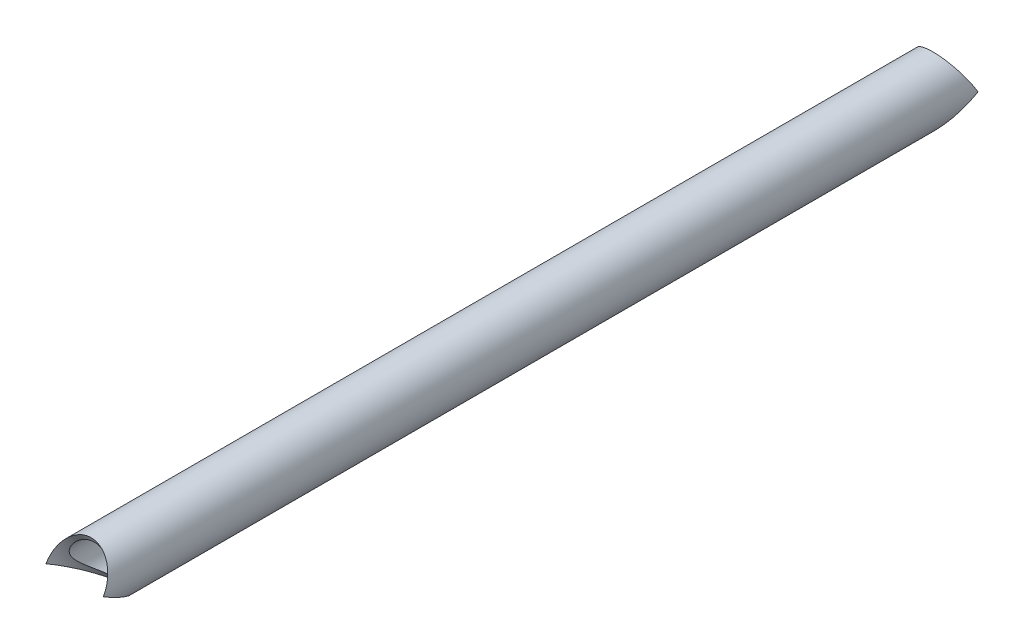
ISO-10303-21;
HEADER;
FILE_DESCRIPTION(('STEP AP214'),'2;1');
FILE_NAME('part.step','',(''),(''),'','','');
FILE_SCHEMA(('AUTOMOTIVE_DESIGN { 1 0 10303 214 1 1 1 1 }'));
ENDSEC;
DATA;
#1=APPLICATION_CONTEXT('core data for automotive mechanical design processes');
#2=APPLICATION_PROTOCOL_DEFINITION('international standard','automotive_design',2000,#1);
#3=PRODUCT_CONTEXT('',#1,'mechanical');
#4=PRODUCT('Part','Part','',(#3));
#5=PRODUCT_RELATED_PRODUCT_CATEGORY('part','',(#4));
#6=PRODUCT_DEFINITION_FORMATION('','',#4);
#7=PRODUCT_DEFINITION_CONTEXT('part definition',#1,'design');
#8=PRODUCT_DEFINITION('design','',#6,#7);
#9=PRODUCT_DEFINITION_SHAPE('','',#8);
#10=(LENGTH_UNIT() NAMED_UNIT(*) SI_UNIT(.MILLI.,.METRE.));
#11=(NAMED_UNIT(*) PLANE_ANGLE_UNIT() SI_UNIT($,.RADIAN.));
#12=(NAMED_UNIT(*) SI_UNIT($,.STERADIAN.) SOLID_ANGLE_UNIT());
#13=UNCERTAINTY_MEASURE_WITH_UNIT(LENGTH_MEASURE(1.E-05),#10,'distance_accuracy_value','');
#14=(GEOMETRIC_REPRESENTATION_CONTEXT(3) GLOBAL_UNCERTAINTY_ASSIGNED_CONTEXT((#13)) GLOBAL_UNIT_ASSIGNED_CONTEXT((#10,
#11,#12)) REPRESENTATION_CONTEXT('',''));
#15=CARTESIAN_POINT('',(0.,0.,0.));
#16=DIRECTION('',(0.,0.,1.));
#17=DIRECTION('',(1.,0.,0.));
#18=AXIS2_PLACEMENT_3D('',#15,#16,#17);
#19=CARTESIAN_POINT('',(0.,0.,-171.724170550286));
#20=DIRECTION('',(0.,0.,1.));
#21=DIRECTION('',(1.,0.,0.));
#22=AXIS2_PLACEMENT_3D('',#19,#20,#21);
#23=CYLINDRICAL_SURFACE('',#22,10.65);
#24=CARTESIAN_POINT('',(0.,0.,-162.499999999988));
#25=DIRECTION('',(0.,0.866025403784403,0.500000000000061));
#26=DIRECTION('',(0.,-0.500000000000061,0.866025403784403));
#27=AXIS2_PLACEMENT_3D('',#24,#25,#26);
#28=ELLIPSE('',#27,21.2999999999974,10.65);
#29=CARTESIAN_POINT('',(-10.65,0.,-162.499999999988));
#30=VERTEX_POINT('',#29);
#31=CARTESIAN_POINT('',(10.65,0.,-162.499999999988));
#32=VERTEX_POINT('',#31);
#33=EDGE_CURVE('E39',#30,#32,#28,.T.);
#34=ORIENTED_EDGE('',*,*,#33,.T.);
#35=CARTESIAN_POINT('',(0.,0.,-162.499999999988));
#36=DIRECTION('',(0.,-0.500000000000061,0.866025403784403));
#37=DIRECTION('',(0.,0.866025403784403,0.500000000000061));
#38=AXIS2_PLACEMENT_3D('',#35,#36,#37);
#39=ELLIPSE('',#38,12.2975607337395,10.65);
#40=EDGE_CURVE('E45',#32,#30,#39,.T.);
#41=ORIENTED_EDGE('',*,*,#40,.T.);
#42=EDGE_LOOP('',(#34,#41));
#43=FACE_BOUND('',#42,.T.);
#44=CARTESIAN_POINT('',(0.,0.,162.499999999988));
#45=DIRECTION('',(0.,-0.866025403784403,0.500000000000061));
#46=DIRECTION('',(0.,-0.500000000000061,-0.866025403784403));
#47=AXIS2_PLACEMENT_3D('',#44,#45,#46);
#48=ELLIPSE('',#47,21.2999999999974,10.65);
#49=CARTESIAN_POINT('',(-10.65,0.,162.499999999988));
#50=VERTEX_POINT('',#49);
#51=CARTESIAN_POINT('',(10.65,0.,162.499999999988));
#52=VERTEX_POINT('',#51);
#53=EDGE_CURVE('E64',#50,#52,#48,.T.);
#54=ORIENTED_EDGE('',*,*,#53,.F.);
#55=CARTESIAN_POINT('',(0.,0.,162.499999999988));
#56=DIRECTION('',(0.,0.500000000000061,0.866025403784403));
#57=DIRECTION('',(0.,0.866025403784403,-0.500000000000061));
#58=AXIS2_PLACEMENT_3D('',#55,#56,#57);
#59=ELLIPSE('',#58,12.2975607337395,10.65);
#60=EDGE_CURVE('E60',#52,#50,#59,.T.);
#61=ORIENTED_EDGE('',*,*,#60,.F.);
#62=EDGE_LOOP('',(#54,#61));
#63=FACE_BOUND('',#62,.T.);
#64=ADVANCED_FACE('F34',(#43,#63),#23,.T.);
#65=CARTESIAN_POINT('',(0.,0.,-171.724170550286));
#66=DIRECTION('',(0.,0.,1.));
#67=DIRECTION('',(1.,0.,0.));
#68=AXIS2_PLACEMENT_3D('',#65,#66,#67);
#69=CYLINDRICAL_SURFACE('',#68,8.65);
#70=CARTESIAN_POINT('',(8.65,0.,-155.325972772088));
#71=CARTESIAN_POINT('',(8.64999937803327,0.146816081959024,-155.410737064371));
#72=CARTESIAN_POINT('',(8.64626274910707,0.296244275213516,-155.490989122961));
#73=CARTESIAN_POINT('',(8.63051404007007,0.59984934855078,-155.641054935581));
#74=CARTESIAN_POINT('',(8.61850310980505,0.754025565976544,-155.710870138338));
#75=CARTESIAN_POINT('',(8.58549136002908,1.06602233182286,-155.838782210506));
#76=CARTESIAN_POINT('',(8.56450206368755,1.22383796449478,-155.896893960435));
#77=CARTESIAN_POINT('',(8.51297710355421,1.54197209714931,-156.000754259453));
#78=CARTESIAN_POINT('',(8.48244146927593,1.70229058939261,-156.046502846763));
#79=CARTESIAN_POINT('',(8.41148621827915,2.02399540492215,-156.125541073761));
#80=CARTESIAN_POINT('',(8.37105601253787,2.18538269078723,-156.158817268455));
#81=CARTESIAN_POINT('',(8.2803069748769,2.50738948163153,-156.213363275992));
#82=CARTESIAN_POINT('',(8.22998781020885,2.6680089605889,-156.234632684733));
#83=CARTESIAN_POINT('',(8.11955918288833,2.98728177036595,-156.266258896899));
#84=CARTESIAN_POINT('',(8.05943008935705,3.14593045785645,-156.276593501467));
#85=CARTESIAN_POINT('',(7.92980127101956,3.45970959557713,-156.287683061107));
#86=CARTESIAN_POINT('',(7.86029883349651,3.61483901206376,-156.288435236914));
#87=CARTESIAN_POINT('',(7.69251740767304,3.96156984906557,-156.281015966262));
#88=CARTESIAN_POINT('',(7.5915181509432,4.15180427951985,-156.270399070282));
#89=CARTESIAN_POINT('',(7.37601667855867,4.52361508494111,-156.239293759734));
#90=CARTESIAN_POINT('',(7.26151062378719,4.70518897757738,-156.218802533397));
#91=CARTESIAN_POINT('',(7.01974442801424,5.05881400137144,-156.170680076051));
#92=CARTESIAN_POINT('',(6.89247464409701,5.23085777793018,-156.143043421462));
#93=CARTESIAN_POINT('',(6.62602035216088,5.56452517200222,-156.082998054737));
#94=CARTESIAN_POINT('',(6.48683667995883,5.7261495190965,-156.050589677247));
#95=CARTESIAN_POINT('',(6.19369921715695,6.04219940893278,-155.98215494356));
#96=CARTESIAN_POINT('',(6.03946719637202,6.19635174221064,-155.946059423688));
#97=CARTESIAN_POINT('',(5.71996280967906,6.49245458198435,-155.872728172188));
#98=CARTESIAN_POINT('',(5.55469039583107,6.63440503549067,-155.835492435611));
#99=CARTESIAN_POINT('',(5.21389860047886,6.90544322934903,-155.761391018285));
#100=CARTESIAN_POINT('',(5.03838164399917,7.0345339943406,-155.724525252362));
#101=CARTESIAN_POINT('',(4.67787691764104,7.27924676280675,-155.652425917008));
#102=CARTESIAN_POINT('',(4.4928889752514,7.39486852082163,-155.617192377329));
#103=CARTESIAN_POINT('',(4.08963935720714,7.62615050104334,-155.545023606646));
#104=CARTESIAN_POINT('',(3.87018262639212,7.73985316133269,-155.50846472843));
#105=CARTESIAN_POINT('',(3.42170434916091,7.94830748089791,-155.44012865221));
#106=CARTESIAN_POINT('',(3.1926819786111,8.04305750320944,-155.408351867302));
#107=CARTESIAN_POINT('',(2.72667233822047,8.21274898224353,-155.350650686961));
#108=CARTESIAN_POINT('',(2.48968464132692,8.2876893749777,-155.324726605892));
#109=CARTESIAN_POINT('',(2.00954587057519,8.41700831165989,-155.279576343042));
#110=CARTESIAN_POINT('',(1.76639521488975,8.47138824672418,-155.260349708122));
#111=CARTESIAN_POINT('',(1.28688815577941,8.55704637630793,-155.229901827243));
#112=CARTESIAN_POINT('',(1.05071773862519,8.58925324184552,-155.21835954427));
#113=CARTESIAN_POINT('',(0.576287751521699,8.63406969930875,-155.202266721929));
#114=CARTESIAN_POINT('',(0.338028232848616,8.64667977088359,-155.197716011435));
#115=CARTESIAN_POINT('',(-0.138694398066317,8.65217181019517,-155.195736176756));
#116=CARTESIAN_POINT('',(-0.377157454410727,8.64505809030459,-155.198305495861));
#117=CARTESIAN_POINT('',(-0.852499060908998,8.61118555813812,-155.210489390296));
#118=CARTESIAN_POINT('',(-1.08937763950015,8.5844270993945,-155.22010383884));
#119=CARTESIAN_POINT('',(-1.55084699910067,8.51292048410127,-155.245609817912));
#120=CARTESIAN_POINT('',(-1.77556361879992,8.46889120636583,-155.26125011511));
#121=CARTESIAN_POINT('',(-2.22033596035188,8.36330373527491,-155.298378878058));
#122=CARTESIAN_POINT('',(-2.44039182888973,8.30174609446286,-155.319867159462));
#123=CARTESIAN_POINT('',(-2.87439182216492,8.16163978904717,-155.368106341145));
#124=CARTESIAN_POINT('',(-3.08833678882609,8.08309347794926,-155.394856512428));
#125=CARTESIAN_POINT('',(-3.50884695015106,7.9096288267266,-155.452876137733));
#126=CARTESIAN_POINT('',(-3.71541192514962,7.81470999976363,-155.484145726136));
#127=CARTESIAN_POINT('',(-4.12561504865979,7.60632550280736,-155.551214714373));
#128=CARTESIAN_POINT('',(-4.32901148650183,7.49241694085081,-155.587116012603));
#129=CARTESIAN_POINT('',(-4.72560996425252,7.24881198973387,-155.661546398176));
#130=CARTESIAN_POINT('',(-4.91881176220241,7.11911522609899,-155.700075547838));
#131=CARTESIAN_POINT('',(-5.29426000335309,6.84452202323135,-155.778409509649));
#132=CARTESIAN_POINT('',(-5.47649012979152,6.69960378460207,-155.818216093058));
#133=CARTESIAN_POINT('',(-5.82873985001168,6.39550122085595,-155.897366036856));
#134=CARTESIAN_POINT('',(-5.99875927649523,6.23631670034467,-155.936709390892));
#135=CARTESIAN_POINT('',(-6.33518765877075,5.89479767143161,-156.015130973092));
#136=CARTESIAN_POINT('',(-6.50081325634467,5.71165555922175,-156.054061057806));
#137=CARTESIAN_POINT('',(-6.81634213928585,5.33114173894931,-156.12624554266));
#138=CARTESIAN_POINT('',(-6.96624167784348,5.13376665862869,-156.159498591397));
#139=CARTESIAN_POINT('',(-7.2488077821706,4.72637376248664,-156.216692809463));
#140=CARTESIAN_POINT('',(-7.38151120832293,4.51638444981239,-156.240654123358));
#141=CARTESIAN_POINT('',(-7.62872444595339,4.08494252577977,-156.275096981689));
#142=CARTESIAN_POINT('',(-7.7432466153079,3.86349783759951,-156.285587716808));
#143=CARTESIAN_POINT('',(-7.91587661528824,3.49105879917881,-156.287844045289));
#144=CARTESIAN_POINT('',(-7.97965328460164,3.34270117829035,-156.284900694865));
#145=CARTESIAN_POINT('',(-8.09865941914438,3.04305332821755,-156.270048936416));
#146=CARTESIAN_POINT('',(-8.15389168150628,2.89176407707169,-156.258143469786));
#147=CARTESIAN_POINT('',(-8.25543809691553,2.58764248887126,-156.224241378967));
#148=CARTESIAN_POINT('',(-8.30176915263798,2.43481366823265,-156.202264154493));
#149=CARTESIAN_POINT('',(-8.38549388456925,2.12865566194757,-156.147376118284));
#150=CARTESIAN_POINT('',(-8.42288752849283,1.97532647449562,-156.114465267053));
#151=CARTESIAN_POINT('',(-8.48887463244825,1.66916263002148,-156.037210100352));
#152=CARTESIAN_POINT('',(-8.51744234753774,1.51633068282755,-155.992833016925));
#153=CARTESIAN_POINT('',(-8.56590540255694,1.21299700955551,-155.89284727686));
#154=CARTESIAN_POINT('',(-8.5858008185474,1.06249526305145,-155.837238718733));
#155=CARTESIAN_POINT('',(-8.61742448664859,0.764808527440551,-155.715386196207));
#156=CARTESIAN_POINT('',(-8.62914387610778,0.61762730436511,-155.649130786212));
#157=CARTESIAN_POINT('',(-8.64501885033618,0.327519305723669,-155.507048963248));
#158=CARTESIAN_POINT('',(-8.64917188260002,0.184593981870724,-155.431219329642));
#159=CARTESIAN_POINT('',(-8.65091176420885,-0.156949863780477,-155.236819963999));
#160=CARTESIAN_POINT('',(-8.64490991978811,-0.35310720221462,-155.113886995581));
#161=CARTESIAN_POINT('',(-8.6208040453733,-0.735525573852803,-154.854576021914));
#162=CARTESIAN_POINT('',(-8.60269349220144,-0.921781214420031,-154.718190803477));
#163=CARTESIAN_POINT('',(-8.55591593176148,-1.28550738599193,-154.434756439225));
#164=CARTESIAN_POINT('',(-8.52721453919813,-1.46294714119607,-154.287673825167));
#165=CARTESIAN_POINT('',(-8.46048539057333,-1.80936872185425,-153.985801014466));
#166=CARTESIAN_POINT('',(-8.42245385331539,-1.97834708467299,-153.831007713259));
#167=CARTESIAN_POINT('',(-8.33930780952945,-2.30340220804404,-153.520917956745));
#168=CARTESIAN_POINT('',(-8.29446233610357,-2.45971951600669,-153.365799881372));
#169=CARTESIAN_POINT('',(-8.19738755510057,-2.7660710624179,-153.051790058831));
#170=CARTESIAN_POINT('',(-8.14515935111437,-2.91610623560018,-152.892898878625));
#171=CARTESIAN_POINT('',(-8.03358147622642,-3.21074819848272,-152.572329218682));
#172=CARTESIAN_POINT('',(-7.97422521882752,-3.3553498029475,-152.410648281094));
#173=CARTESIAN_POINT('',(-7.84858289044827,-3.63955859805015,-152.08557325988));
#174=CARTESIAN_POINT('',(-7.78229605383352,-3.77916523459294,-151.922178988776));
#175=CARTESIAN_POINT('',(-7.64278789689208,-4.05389196675663,-151.594397652862));
#176=CARTESIAN_POINT('',(-7.56956237191912,-4.18900927413151,-151.43001004333));
#177=CARTESIAN_POINT('',(-7.41613086611594,-4.45500589104837,-151.101036104025));
#178=CARTESIAN_POINT('',(-7.33592422353144,-4.58588479720677,-150.936449756874));
#179=CARTESIAN_POINT('',(-7.16842967186148,-4.8435222937845,-150.607864080426));
#180=CARTESIAN_POINT('',(-7.08114669097992,-4.97028366707048,-150.44386442425));
#181=CARTESIAN_POINT('',(-6.89920629382396,-5.21989446778605,-150.116981564183));
#182=CARTESIAN_POINT('',(-6.80454875727006,-5.34274383136443,-149.95409837855));
#183=CARTESIAN_POINT('',(-6.56519981119283,-5.63652476754035,-149.560467144414));
#184=CARTESIAN_POINT('',(-6.41648661666548,-5.80543409324396,-149.330632667275));
#185=CARTESIAN_POINT('',(-6.10210401419185,-6.13503862008348,-148.876624735802));
#186=CARTESIAN_POINT('',(-5.93643204735898,-6.29573257611198,-148.652452142163));
#187=CARTESIAN_POINT('',(-5.58706670598719,-6.60771567513529,-148.212833358225));
#188=CARTESIAN_POINT('',(-5.40341885193564,-6.75902706620638,-147.997366982632));
#189=CARTESIAN_POINT('',(-5.01605964051006,-7.05127589792345,-147.57777174364));
#190=CARTESIAN_POINT('',(-4.81235869354434,-7.19221865565128,-147.373637082656));
#191=CARTESIAN_POINT('',(-4.46395431537829,-7.41083600101227,-147.054881248702));
#192=CARTESIAN_POINT('',(-4.32596965085849,-7.49232653536422,-146.935533086679));
#193=CARTESIAN_POINT('',(-4.0410469326951,-7.64976821723835,-146.704098076909));
#194=CARTESIAN_POINT('',(-3.89410768994086,-7.7257186261124,-146.592012197642));
#195=CARTESIAN_POINT('',(-3.43953622820841,-7.94386343121108,-146.269051576002));
#196=CARTESIAN_POINT('',(-3.11767000653623,-8.07666052908448,-146.071021372907));
#197=CARTESIAN_POINT('',(-2.51329904826429,-8.28148682179235,-145.764318388833));
#198=CARTESIAN_POINT('',(-2.23837288737336,-8.36046704646153,-145.645565491786));
#199=CARTESIAN_POINT('',(-1.81149183588574,-8.45945594403171,-145.496414021522));
#200=CARTESIAN_POINT('',(-1.6667769628448,-8.48920611182494,-145.451525332948));
#201=CARTESIAN_POINT('',(-1.37323763265839,-8.54159866338096,-145.372404269769));
#202=CARTESIAN_POINT('',(-1.22441515227441,-8.5642444033887,-145.338166863392));
#203=CARTESIAN_POINT('',(-0.922228530535068,-8.60205755265219,-145.280966306509));
#204=CARTESIAN_POINT('',(-0.768835207762957,-8.61715426873134,-145.258109740521));
#205=CARTESIAN_POINT('',(-0.460111209939347,-8.63913996562373,-145.224814707238));
#206=CARTESIAN_POINT('',(-0.304780550296949,-8.64602901167674,-145.214376141237));
#207=CARTESIAN_POINT('',(0.00631804623093485,-8.65139623435879,-145.206243954802));
#208=CARTESIAN_POINT('',(0.162085851106558,-8.64987672364475,-145.208546830011));
#209=CARTESIAN_POINT('',(0.472597570432602,-8.63847707174814,-145.225817188645));
#210=CARTESIAN_POINT('',(0.627341552834132,-8.62859749114884,-145.240783822903));
#211=CARTESIAN_POINT('',(0.914629127248858,-8.60255793238128,-145.280204943442));
#212=CARTESIAN_POINT('',(1.04746675019244,-8.58736989768247,-145.303190419323));
#213=CARTESIAN_POINT('',(1.31053948151336,-8.55117749183125,-145.357920415879));
#214=CARTESIAN_POINT('',(1.44077378597029,-8.53017135287814,-145.389667598743));
#215=CARTESIAN_POINT('',(1.82650942834301,-8.45899700788946,-145.49712882047));
#216=CARTESIAN_POINT('',(2.07716005820095,-8.40066180144346,-145.585079358321));
#217=CARTESIAN_POINT('',(2.6770104496411,-8.23370673696818,-145.836024798871));
#218=CARTESIAN_POINT('',(3.01657143771817,-8.11435977268494,-146.014828200674));
#219=CARTESIAN_POINT('',(3.496943880243,-7.91354700861253,-146.313737924121));
#220=CARTESIAN_POINT('',(3.65245291749683,-7.84285392322129,-146.418673924901));
#221=CARTESIAN_POINT('',(3.95415605806186,-7.69514787605173,-146.637153209234));
#222=CARTESIAN_POINT('',(4.10035178316865,-7.61813601998088,-146.750694986618));
#223=CARTESIAN_POINT('',(4.47217067277705,-7.40891362515318,-147.05792163374));
#224=CARTESIAN_POINT('',(4.69046621582072,-7.27223187431283,-147.257426117818));
#225=CARTESIAN_POINT('',(5.10542040241966,-6.98717222943725,-147.670165436617));
#226=CARTESIAN_POINT('',(5.30206445824694,-6.83878656401101,-147.883409376825));
#227=CARTESIAN_POINT('',(5.67619689273716,-6.53162024880792,-148.320567546934));
#228=CARTESIAN_POINT('',(5.85361633779415,-6.37280527149127,-148.544516277916));
#229=CARTESIAN_POINT('',(6.19021131259973,-6.04638212262884,-148.999431174916));
#230=CARTESIAN_POINT('',(6.34939068740908,-5.8787758152213,-149.230395848918));
#231=CARTESIAN_POINT('',(6.61712450602697,-5.57382780542619,-149.644664400951));
#232=CARTESIAN_POINT('',(6.72902472853531,-5.43813227085378,-149.827035955309));
#233=CARTESIAN_POINT('',(6.94326792392695,-5.16179289997203,-150.193670096302));
#234=CARTESIAN_POINT('',(7.04560988610069,-5.02114854252423,-150.377932880639));
#235=CARTESIAN_POINT('',(7.24122557898458,-4.73468727116116,-150.747590815755));
#236=CARTESIAN_POINT('',(7.33449006193031,-4.58886528463063,-150.932986920983));
#237=CARTESIAN_POINT('',(7.51210861764647,-4.29192902938011,-151.303792368142));
#238=CARTESIAN_POINT('',(7.5964631420165,-4.14081502940228,-151.489201708925));
#239=CARTESIAN_POINT('',(7.75620337110364,-3.83324485942029,-151.85858541107));
#240=CARTESIAN_POINT('',(7.83161100983149,-3.67680301725855,-152.042562203395));
#241=CARTESIAN_POINT('',(7.97368173187745,-3.35759257522564,-152.408446495093));
#242=CARTESIAN_POINT('',(8.04034383363399,-3.19482326784,-152.590353760101));
#243=CARTESIAN_POINT('',(8.16459670931703,-2.86239573466255,-152.950475011075));
#244=CARTESIAN_POINT('',(8.22219981237258,-2.69274727408345,-153.128693724944));
#245=CARTESIAN_POINT('',(8.32794134031474,-2.34539006346021,-153.479951363562));
#246=CARTESIAN_POINT('',(8.37608284212222,-2.16768395698309,-153.65299195667));
#247=CARTESIAN_POINT('',(8.45472823516462,-1.83416947842856,-153.962765379019));
#248=CARTESIAN_POINT('',(8.48684042866997,-1.67981212056009,-154.100647413262));
#249=CARTESIAN_POINT('',(8.5432893521119,-1.36398150873694,-154.369760649949));
#250=CARTESIAN_POINT('',(8.56762596647506,-1.20250814905315,-154.500991753511));
#251=CARTESIAN_POINT('',(8.60751619567126,-0.872218793655188,-154.75448099804));
#252=CARTESIAN_POINT('',(8.62309164938045,-0.703422195246976,-154.876760783367));
#253=CARTESIAN_POINT('',(8.64433263886581,-0.357736822610709,-155.110298291125));
#254=CARTESIAN_POINT('',(8.65000076614763,-0.180850176960578,-155.221558888712));
#255=CARTESIAN_POINT('',(8.65,0.,-155.325972772088));
#256=B_SPLINE_CURVE_WITH_KNOTS('',3,(#70,#71,#72,#73,#74,#75,#76,#77,#78,#79,#80,#81,#82,#83,
#84,#85,#86,#87,#88,#89,#90,#91,#92,#93,#94,#95,#96,#97,#98,#99,#100,#101,#102,#103,#104,#105,
#106,#107,#108,#109,#110,#111,#112,#113,#114,#115,#116,#117,#118,#119,#120,#121,#122,#123,#124,
#125,#126,#127,#128,#129,#130,#131,#132,#133,#134,#135,#136,#137,#138,#139,#140,#141,#142,#143,
#144,#145,#146,#147,#148,#149,#150,#151,#152,#153,#154,#155,#156,#157,#158,#159,#160,#161,#162,
#163,#164,#165,#166,#167,#168,#169,#170,#171,#172,#173,#174,#175,#176,#177,#178,#179,#180,#181,
#182,#183,#184,#185,#186,#187,#188,#189,#190,#191,#192,#193,#194,#195,#196,#197,#198,#199,#200,
#201,#202,#203,#204,#205,#206,#207,#208,#209,#210,#211,#212,#213,#214,#215,#216,#217,#218,#219,
#220,#221,#222,#223,#224,#225,#226,#227,#228,#229,#230,#231,#232,#233,#234,#235,#236,#237,#238,
#239,#240,#241,#242,#243,#244,#245,#246,#247,#248,#249,#250,#251,#252,#253,#254,#255),
.UNSPECIFIED.,.T.,.F.,(4,2,2,2,2,2,2,2,2,2,2,2,2,2,2,2,2,2,2,2,2,2,2,2,2,2,2,2,2,2,2,2,2,2,2,2,
2,2,2,2,2,2,2,2,2,2,2,2,2,2,2,2,2,2,2,2,2,2,2,2,2,2,2,2,2,2,2,2,2,2,2,2,2,2,2,2,2,2,2,2,2,2,2,2,
2,2,2,2,2,2,2,2,4),(0.,0.508445067700352,1.01681949312027,1.52454340032987,2.03226573787248,
2.54053382673746,3.04881902097657,3.55813412185338,4.06759693996556,4.71359002947275,
5.35976717786704,6.00643624012442,6.65305997254505,7.31551844685104,7.97797979789367,
8.64028496620578,9.30260220250592,10.0512091879155,10.7998808036047,11.5485926227779,
12.2972537751971,13.0122575701419,13.727243864449,14.4420738478249,15.1568909672333,
15.8446653307739,16.5324180161267,17.220075485415,17.907753405786,18.6145823037834,
19.3214279700608,20.0293001149053,20.7371819564205,21.4861817527542,22.2353595985677,
22.9829040159493,23.7299381285012,24.2140392664685,24.6979815901785,25.1809956610562,
25.6640114767331,26.1484232132306,26.6328307010898,27.1177624646541,27.6028577893435,
28.2964167818696,28.9903497083936,29.6865557409419,30.3830443900297,31.056994465983,
31.7308439043487,32.4053208577863,33.0798724008733,33.754835349197,34.4298623484515,
35.1044232089342,35.7789950738535,36.7434305731184,37.708011809881,38.6702106916393,
39.6319126633937,40.2309613246269,40.8300897097659,42.0261773485567,42.9515592316293,
43.4142860297687,43.8767938980607,44.3435554209346,44.8103132336666,45.2769426775161,
45.7435408340748,46.1500870679648,46.5567569645808,47.3697458590118,48.5683011522666,
49.1693990091061,49.7703919045984,50.7462014804335,51.7226645377543,52.7025204724635,
53.6821694691646,54.4420360299659,55.20198284982,55.962695941976,56.723370459009,
57.4821398028628,58.2409942350116,58.9988067717561,59.7563724579483,60.3844095628076,
61.0124560021506,61.6389298975941,62.2652398987969),.UNSPECIFIED.);
#257=CARTESIAN_POINT('',(8.65,0.,-155.325972772088));
#258=VERTEX_POINT('',#257);
#259=EDGE_CURVE('E11',#258,#258,#256,.T.);
#260=ORIENTED_EDGE('',*,*,#259,.F.);
#261=EDGE_LOOP('',(#260));
#262=FACE_BOUND('',#261,.T.);
#263=CARTESIAN_POINT('',(8.65,0.,155.325972772088));
#264=CARTESIAN_POINT('',(8.64999937803327,0.146816081959024,155.410737064371));
#265=CARTESIAN_POINT('',(8.64626274910707,0.296244275213516,155.490989122961));
#266=CARTESIAN_POINT('',(8.63051404007007,0.59984934855078,155.641054935581));
#267=CARTESIAN_POINT('',(8.61850310980505,0.754025565976544,155.710870138338));
#268=CARTESIAN_POINT('',(8.58549136002908,1.06602233182286,155.838782210506));
#269=CARTESIAN_POINT('',(8.56450206368755,1.22383796449478,155.896893960435));
#270=CARTESIAN_POINT('',(8.51297710355421,1.54197209714931,156.000754259453));
#271=CARTESIAN_POINT('',(8.48244146927593,1.70229058939261,156.046502846763));
#272=CARTESIAN_POINT('',(8.41148621827915,2.02399540492215,156.125541073761));
#273=CARTESIAN_POINT('',(8.37105601253787,2.18538269078723,156.158817268455));
#274=CARTESIAN_POINT('',(8.2803069748769,2.50738948163153,156.213363275992));
#275=CARTESIAN_POINT('',(8.22998781020885,2.6680089605889,156.234632684733));
#276=CARTESIAN_POINT('',(8.11955918288833,2.98728177036595,156.266258896899));
#277=CARTESIAN_POINT('',(8.05943008935705,3.14593045785645,156.276593501467));
#278=CARTESIAN_POINT('',(7.92980127101956,3.45970959557713,156.287683061107));
#279=CARTESIAN_POINT('',(7.86029883349651,3.61483901206376,156.288435236914));
#280=CARTESIAN_POINT('',(7.69251740767304,3.96156984906557,156.281015966262));
#281=CARTESIAN_POINT('',(7.5915181509432,4.15180427951985,156.270399070282));
#282=CARTESIAN_POINT('',(7.37601667855867,4.52361508494111,156.239293759734));
#283=CARTESIAN_POINT('',(7.26151062378719,4.70518897757738,156.218802533397));
#284=CARTESIAN_POINT('',(7.01974442801424,5.05881400137144,156.170680076051));
#285=CARTESIAN_POINT('',(6.89247464409701,5.23085777793018,156.143043421462));
#286=CARTESIAN_POINT('',(6.62602035216088,5.56452517200222,156.082998054737));
#287=CARTESIAN_POINT('',(6.48683667995883,5.7261495190965,156.050589677247));
#288=CARTESIAN_POINT('',(6.19369921715695,6.04219940893278,155.98215494356));
#289=CARTESIAN_POINT('',(6.03946719637202,6.19635174221064,155.946059423688));
#290=CARTESIAN_POINT('',(5.71996280967906,6.49245458198435,155.872728172188));
#291=CARTESIAN_POINT('',(5.55469039583107,6.63440503549067,155.835492435611));
#292=CARTESIAN_POINT('',(5.21389860047886,6.90544322934903,155.761391018285));
#293=CARTESIAN_POINT('',(5.03838164399917,7.0345339943406,155.724525252362));
#294=CARTESIAN_POINT('',(4.67787691764104,7.27924676280675,155.652425917008));
#295=CARTESIAN_POINT('',(4.4928889752514,7.39486852082163,155.617192377329));
#296=CARTESIAN_POINT('',(4.08963935720714,7.62615050104334,155.545023606646));
#297=CARTESIAN_POINT('',(3.87018262639212,7.73985316133269,155.50846472843));
#298=CARTESIAN_POINT('',(3.42170434916091,7.94830748089791,155.44012865221));
#299=CARTESIAN_POINT('',(3.1926819786111,8.04305750320944,155.408351867302));
#300=CARTESIAN_POINT('',(2.72667233822047,8.21274898224353,155.350650686961));
#301=CARTESIAN_POINT('',(2.48968464132692,8.2876893749777,155.324726605892));
#302=CARTESIAN_POINT('',(2.00954587057519,8.41700831165989,155.279576343042));
#303=CARTESIAN_POINT('',(1.76639521488975,8.47138824672418,155.260349708122));
#304=CARTESIAN_POINT('',(1.28688815577941,8.55704637630793,155.229901827243));
#305=CARTESIAN_POINT('',(1.05071773862519,8.58925324184552,155.21835954427));
#306=CARTESIAN_POINT('',(0.576287751521699,8.63406969930875,155.202266721929));
#307=CARTESIAN_POINT('',(0.338028232848616,8.64667977088359,155.197716011435));
#308=CARTESIAN_POINT('',(-0.138694398066317,8.65217181019517,155.195736176756));
#309=CARTESIAN_POINT('',(-0.377157454410727,8.64505809030459,155.198305495861));
#310=CARTESIAN_POINT('',(-0.852499060908998,8.61118555813812,155.210489390296));
#311=CARTESIAN_POINT('',(-1.08937763950015,8.5844270993945,155.22010383884));
#312=CARTESIAN_POINT('',(-1.55084699910067,8.51292048410127,155.245609817912));
#313=CARTESIAN_POINT('',(-1.77556361879992,8.46889120636583,155.26125011511));
#314=CARTESIAN_POINT('',(-2.22033596035188,8.36330373527491,155.298378878058));
#315=CARTESIAN_POINT('',(-2.44039182888973,8.30174609446286,155.319867159462));
#316=CARTESIAN_POINT('',(-2.87439182216492,8.16163978904717,155.368106341145));
#317=CARTESIAN_POINT('',(-3.08833678882609,8.08309347794926,155.394856512428));
#318=CARTESIAN_POINT('',(-3.50884695015106,7.9096288267266,155.452876137733));
#319=CARTESIAN_POINT('',(-3.71541192514962,7.81470999976363,155.484145726136));
#320=CARTESIAN_POINT('',(-4.12561504865979,7.60632550280736,155.551214714373));
#321=CARTESIAN_POINT('',(-4.32901148650183,7.49241694085081,155.587116012603));
#322=CARTESIAN_POINT('',(-4.72560996425252,7.24881198973387,155.661546398176));
#323=CARTESIAN_POINT('',(-4.91881176220241,7.11911522609899,155.700075547838));
#324=CARTESIAN_POINT('',(-5.29426000335309,6.84452202323135,155.778409509649));
#325=CARTESIAN_POINT('',(-5.47649012979152,6.69960378460207,155.818216093058));
#326=CARTESIAN_POINT('',(-5.82873985001168,6.39550122085595,155.897366036856));
#327=CARTESIAN_POINT('',(-5.99875927649523,6.23631670034467,155.936709390892));
#328=CARTESIAN_POINT('',(-6.33518765877075,5.89479767143161,156.015130973092));
#329=CARTESIAN_POINT('',(-6.50081325634467,5.71165555922175,156.054061057806));
#330=CARTESIAN_POINT('',(-6.81634213928585,5.33114173894931,156.12624554266));
#331=CARTESIAN_POINT('',(-6.96624167784348,5.13376665862869,156.159498591397));
#332=CARTESIAN_POINT('',(-7.2488077821706,4.72637376248664,156.216692809463));
#333=CARTESIAN_POINT('',(-7.38151120832293,4.51638444981239,156.240654123358));
#334=CARTESIAN_POINT('',(-7.62872444595339,4.08494252577977,156.275096981689));
#335=CARTESIAN_POINT('',(-7.7432466153079,3.86349783759951,156.285587716808));
#336=CARTESIAN_POINT('',(-7.91587661528824,3.49105879917881,156.287844045289));
#337=CARTESIAN_POINT('',(-7.97965328460164,3.34270117829035,156.284900694865));
#338=CARTESIAN_POINT('',(-8.09865941914438,3.04305332821755,156.270048936416));
#339=CARTESIAN_POINT('',(-8.15389168150628,2.89176407707169,156.258143469786));
#340=CARTESIAN_POINT('',(-8.25543809691553,2.58764248887126,156.224241378967));
#341=CARTESIAN_POINT('',(-8.30176915263798,2.43481366823265,156.202264154493));
#342=CARTESIAN_POINT('',(-8.38549388456925,2.12865566194757,156.147376118284));
#343=CARTESIAN_POINT('',(-8.42288752849283,1.97532647449562,156.114465267053));
#344=CARTESIAN_POINT('',(-8.48887463244825,1.66916263002148,156.037210100352));
#345=CARTESIAN_POINT('',(-8.51744234753774,1.51633068282755,155.992833016925));
#346=CARTESIAN_POINT('',(-8.56590540255694,1.21299700955551,155.89284727686));
#347=CARTESIAN_POINT('',(-8.5858008185474,1.06249526305145,155.837238718733));
#348=CARTESIAN_POINT('',(-8.61742448664859,0.764808527440551,155.715386196207));
#349=CARTESIAN_POINT('',(-8.62914387610778,0.61762730436511,155.649130786212));
#350=CARTESIAN_POINT('',(-8.64501885033618,0.327519305723669,155.507048963248));
#351=CARTESIAN_POINT('',(-8.64917188260002,0.184593981870724,155.431219329642));
#352=CARTESIAN_POINT('',(-8.65091176420885,-0.156949863780477,155.236819963999));
#353=CARTESIAN_POINT('',(-8.64490991978811,-0.35310720221462,155.113886995581));
#354=CARTESIAN_POINT('',(-8.6208040453733,-0.735525573852803,154.854576021914));
#355=CARTESIAN_POINT('',(-8.60269349220144,-0.921781214420031,154.718190803477));
#356=CARTESIAN_POINT('',(-8.55591593176148,-1.28550738599193,154.434756439225));
#357=CARTESIAN_POINT('',(-8.52721453919813,-1.46294714119607,154.287673825167));
#358=CARTESIAN_POINT('',(-8.46048539057333,-1.80936872185425,153.985801014466));
#359=CARTESIAN_POINT('',(-8.42245385331539,-1.97834708467299,153.831007713259));
#360=CARTESIAN_POINT('',(-8.33930780952945,-2.30340220804404,153.520917956745));
#361=CARTESIAN_POINT('',(-8.29446233610357,-2.45971951600669,153.365799881372));
#362=CARTESIAN_POINT('',(-8.19738755510057,-2.7660710624179,153.051790058831));
#363=CARTESIAN_POINT('',(-8.14515935111437,-2.91610623560018,152.892898878625));
#364=CARTESIAN_POINT('',(-8.03358147622642,-3.21074819848272,152.572329218682));
#365=CARTESIAN_POINT('',(-7.97422521882752,-3.3553498029475,152.410648281094));
#366=CARTESIAN_POINT('',(-7.84858289044827,-3.63955859805015,152.08557325988));
#367=CARTESIAN_POINT('',(-7.78229605383352,-3.77916523459294,151.922178988776));
#368=CARTESIAN_POINT('',(-7.64278789689208,-4.05389196675663,151.594397652862));
#369=CARTESIAN_POINT('',(-7.56956237191912,-4.18900927413151,151.43001004333));
#370=CARTESIAN_POINT('',(-7.41613086611594,-4.45500589104837,151.101036104025));
#371=CARTESIAN_POINT('',(-7.33592422353144,-4.58588479720677,150.936449756874));
#372=CARTESIAN_POINT('',(-7.16842967186148,-4.8435222937845,150.607864080426));
#373=CARTESIAN_POINT('',(-7.08114669097992,-4.97028366707048,150.44386442425));
#374=CARTESIAN_POINT('',(-6.89920629382396,-5.21989446778605,150.116981564183));
#375=CARTESIAN_POINT('',(-6.80454875727006,-5.34274383136443,149.95409837855));
#376=CARTESIAN_POINT('',(-6.56519981119283,-5.63652476754035,149.560467144414));
#377=CARTESIAN_POINT('',(-6.41648661666548,-5.80543409324396,149.330632667275));
#378=CARTESIAN_POINT('',(-6.10210401419185,-6.13503862008348,148.876624735802));
#379=CARTESIAN_POINT('',(-5.93643204735898,-6.29573257611198,148.652452142163));
#380=CARTESIAN_POINT('',(-5.58706670598719,-6.60771567513529,148.212833358225));
#381=CARTESIAN_POINT('',(-5.40341885193564,-6.75902706620638,147.997366982632));
#382=CARTESIAN_POINT('',(-5.01605964051006,-7.05127589792345,147.57777174364));
#383=CARTESIAN_POINT('',(-4.81235869354434,-7.19221865565128,147.373637082656));
#384=CARTESIAN_POINT('',(-4.46395431537829,-7.41083600101227,147.054881248702));
#385=CARTESIAN_POINT('',(-4.32596965085849,-7.49232653536422,146.935533086679));
#386=CARTESIAN_POINT('',(-4.0410469326951,-7.64976821723835,146.704098076909));
#387=CARTESIAN_POINT('',(-3.89410768994086,-7.7257186261124,146.592012197642));
#388=CARTESIAN_POINT('',(-3.43953622820841,-7.94386343121108,146.269051576002));
#389=CARTESIAN_POINT('',(-3.11767000653623,-8.07666052908448,146.071021372907));
#390=CARTESIAN_POINT('',(-2.51329904826429,-8.28148682179235,145.764318388833));
#391=CARTESIAN_POINT('',(-2.23837288737336,-8.36046704646153,145.645565491786));
#392=CARTESIAN_POINT('',(-1.81149183588574,-8.45945594403171,145.496414021522));
#393=CARTESIAN_POINT('',(-1.6667769628448,-8.48920611182494,145.451525332948));
#394=CARTESIAN_POINT('',(-1.37323763265839,-8.54159866338096,145.372404269769));
#395=CARTESIAN_POINT('',(-1.22441515227441,-8.5642444033887,145.338166863392));
#396=CARTESIAN_POINT('',(-0.922228530535068,-8.60205755265219,145.280966306509));
#397=CARTESIAN_POINT('',(-0.768835207762957,-8.61715426873134,145.258109740521));
#398=CARTESIAN_POINT('',(-0.460111209939347,-8.63913996562373,145.224814707238));
#399=CARTESIAN_POINT('',(-0.304780550296949,-8.64602901167674,145.214376141237));
#400=CARTESIAN_POINT('',(0.00631804623093485,-8.65139623435879,145.206243954802));
#401=CARTESIAN_POINT('',(0.162085851106558,-8.64987672364475,145.208546830011));
#402=CARTESIAN_POINT('',(0.472597570432602,-8.63847707174814,145.225817188645));
#403=CARTESIAN_POINT('',(0.627341552834132,-8.62859749114884,145.240783822903));
#404=CARTESIAN_POINT('',(0.914629127248858,-8.60255793238128,145.280204943442));
#405=CARTESIAN_POINT('',(1.04746675019244,-8.58736989768247,145.303190419323));
#406=CARTESIAN_POINT('',(1.31053948151336,-8.55117749183125,145.357920415879));
#407=CARTESIAN_POINT('',(1.44077378597029,-8.53017135287814,145.389667598743));
#408=CARTESIAN_POINT('',(1.82650942834301,-8.45899700788946,145.49712882047));
#409=CARTESIAN_POINT('',(2.07716005820095,-8.40066180144346,145.585079358321));
#410=CARTESIAN_POINT('',(2.6770104496411,-8.23370673696818,145.836024798871));
#411=CARTESIAN_POINT('',(3.01657143771817,-8.11435977268494,146.014828200674));
#412=CARTESIAN_POINT('',(3.496943880243,-7.91354700861253,146.313737924121));
#413=CARTESIAN_POINT('',(3.65245291749683,-7.84285392322129,146.418673924901));
#414=CARTESIAN_POINT('',(3.95415605806186,-7.69514787605173,146.637153209234));
#415=CARTESIAN_POINT('',(4.10035178316865,-7.61813601998088,146.750694986618));
#416=CARTESIAN_POINT('',(4.47217067277705,-7.40891362515318,147.05792163374));
#417=CARTESIAN_POINT('',(4.69046621582072,-7.27223187431283,147.257426117818));
#418=CARTESIAN_POINT('',(5.10542040241966,-6.98717222943725,147.670165436617));
#419=CARTESIAN_POINT('',(5.30206445824694,-6.83878656401101,147.883409376825));
#420=CARTESIAN_POINT('',(5.67619689273716,-6.53162024880792,148.320567546934));
#421=CARTESIAN_POINT('',(5.85361633779415,-6.37280527149127,148.544516277916));
#422=CARTESIAN_POINT('',(6.19021131259973,-6.04638212262884,148.999431174916));
#423=CARTESIAN_POINT('',(6.34939068740908,-5.8787758152213,149.230395848918));
#424=CARTESIAN_POINT('',(6.61712450602697,-5.57382780542619,149.644664400951));
#425=CARTESIAN_POINT('',(6.72902472853531,-5.43813227085378,149.827035955309));
#426=CARTESIAN_POINT('',(6.94326792392695,-5.16179289997203,150.193670096302));
#427=CARTESIAN_POINT('',(7.04560988610069,-5.02114854252423,150.377932880639));
#428=CARTESIAN_POINT('',(7.24122557898458,-4.73468727116116,150.747590815755));
#429=CARTESIAN_POINT('',(7.33449006193031,-4.58886528463063,150.932986920983));
#430=CARTESIAN_POINT('',(7.51210861764647,-4.29192902938011,151.303792368142));
#431=CARTESIAN_POINT('',(7.5964631420165,-4.14081502940228,151.489201708925));
#432=CARTESIAN_POINT('',(7.75620337110364,-3.83324485942029,151.85858541107));
#433=CARTESIAN_POINT('',(7.83161100983149,-3.67680301725855,152.042562203395));
#434=CARTESIAN_POINT('',(7.97368173187745,-3.35759257522564,152.408446495093));
#435=CARTESIAN_POINT('',(8.04034383363399,-3.19482326784,152.590353760101));
#436=CARTESIAN_POINT('',(8.16459670931703,-2.86239573466255,152.950475011075));
#437=CARTESIAN_POINT('',(8.22219981237258,-2.69274727408345,153.128693724944));
#438=CARTESIAN_POINT('',(8.32794134031474,-2.34539006346021,153.479951363562));
#439=CARTESIAN_POINT('',(8.37608284212222,-2.16768395698309,153.65299195667));
#440=CARTESIAN_POINT('',(8.45472823516462,-1.83416947842856,153.962765379019));
#441=CARTESIAN_POINT('',(8.48684042866997,-1.67981212056009,154.100647413262));
#442=CARTESIAN_POINT('',(8.5432893521119,-1.36398150873694,154.369760649949));
#443=CARTESIAN_POINT('',(8.56762596647506,-1.20250814905315,154.500991753511));
#444=CARTESIAN_POINT('',(8.60751619567126,-0.872218793655188,154.75448099804));
#445=CARTESIAN_POINT('',(8.62309164938045,-0.703422195246976,154.876760783367));
#446=CARTESIAN_POINT('',(8.64433263886581,-0.357736822610709,155.110298291125));
#447=CARTESIAN_POINT('',(8.65000076614763,-0.180850176960578,155.221558888712));
#448=CARTESIAN_POINT('',(8.65,0.,155.325972772088));
#449=B_SPLINE_CURVE_WITH_KNOTS('',3,(#263,#264,#265,#266,#267,#268,#269,#270,#271,#272,#273,
#274,#275,#276,#277,#278,#279,#280,#281,#282,#283,#284,#285,#286,#287,#288,#289,#290,#291,#292,
#293,#294,#295,#296,#297,#298,#299,#300,#301,#302,#303,#304,#305,#306,#307,#308,#309,#310,#311,
#312,#313,#314,#315,#316,#317,#318,#319,#320,#321,#322,#323,#324,#325,#326,#327,#328,#329,#330,
#331,#332,#333,#334,#335,#336,#337,#338,#339,#340,#341,#342,#343,#344,#345,#346,#347,#348,#349,
#350,#351,#352,#353,#354,#355,#356,#357,#358,#359,#360,#361,#362,#363,#364,#365,#366,#367,#368,
#369,#370,#371,#372,#373,#374,#375,#376,#377,#378,#379,#380,#381,#382,#383,#384,#385,#386,#387,
#388,#389,#390,#391,#392,#393,#394,#395,#396,#397,#398,#399,#400,#401,#402,#403,#404,#405,#406,
#407,#408,#409,#410,#411,#412,#413,#414,#415,#416,#417,#418,#419,#420,#421,#422,#423,#424,#425,
#426,#427,#428,#429,#430,#431,#432,#433,#434,#435,#436,#437,#438,#439,#440,#441,#442,#443,#444,
#445,#446,#447,#448),.UNSPECIFIED.,.T.,.F.,(4,2,2,2,2,2,2,2,2,2,2,2,2,2,2,2,2,2,2,2,2,2,2,2,2,2,
2,2,2,2,2,2,2,2,2,2,2,2,2,2,2,2,2,2,2,2,2,2,2,2,2,2,2,2,2,2,2,2,2,2,2,2,2,2,2,2,2,2,2,2,2,2,2,2,
2,2,2,2,2,2,2,2,2,2,2,2,2,2,2,2,2,2,4),(0.,0.508445067700352,1.01681949312027,1.52454340032987,
2.03226573787248,2.54053382673746,3.04881902097657,3.55813412185338,4.06759693996556,
4.71359002947275,5.35976717786704,6.00643624012442,6.65305997254505,7.31551844685104,
7.97797979789367,8.64028496620578,9.30260220250592,10.0512091879155,10.7998808036047,
11.5485926227779,12.2972537751971,13.0122575701419,13.727243864449,14.4420738478249,
15.1568909672333,15.8446653307739,16.5324180161267,17.220075485415,17.907753405786,
18.6145823037834,19.3214279700608,20.0293001149053,20.7371819564205,21.4861817527542,
22.2353595985677,22.9829040159493,23.7299381285012,24.2140392664685,24.6979815901785,
25.1809956610562,25.6640114767331,26.1484232132306,26.6328307010898,27.1177624646541,
27.6028577893435,28.2964167818696,28.9903497083936,29.6865557409419,30.3830443900297,
31.056994465983,31.7308439043487,32.4053208577863,33.0798724008733,33.754835349197,
34.4298623484515,35.1044232089342,35.7789950738535,36.7434305731184,37.708011809881,
38.6702106916393,39.6319126633937,40.2309613246269,40.8300897097659,42.0261773485567,
42.9515592316293,43.4142860297687,43.8767938980607,44.3435554209346,44.8103132336666,
45.2769426775161,45.7435408340748,46.1500870679648,46.5567569645808,47.3697458590118,
48.5683011522666,49.1693990091061,49.7703919045984,50.7462014804335,51.7226645377543,
52.7025204724635,53.6821694691646,54.4420360299659,55.20198284982,55.962695941976,
56.723370459009,57.4821398028628,58.2409942350116,58.9988067717561,59.7563724579483,
60.3844095628076,61.0124560021506,61.6389298975941,62.2652398987969),.UNSPECIFIED.);
#450=CARTESIAN_POINT('',(8.65,0.,155.325972772088));
#451=VERTEX_POINT('',#450);
#452=EDGE_CURVE('E66',#451,#451,#449,.T.);
#453=ORIENTED_EDGE('',*,*,#452,.T.);
#454=EDGE_LOOP('',(#453));
#455=FACE_BOUND('',#454,.T.);
#456=ADVANCED_FACE('F73',(#262,#455),#69,.F.);
#457=CARTESIAN_POINT('',(0.,-1.22957199977236E-11,-162.499999999981));
#458=DIRECTION('',(0.,-0.86602540378451,0.499999999999877));
#459=DIRECTION('',(-1.,0.,0.));
#460=AXIS2_PLACEMENT_3D('',#457,#458,#459);
#461=CYLINDRICAL_SURFACE('',#460,10.65);
#462=ORIENTED_EDGE('',*,*,#40,.F.);
#463=ORIENTED_EDGE('',*,*,#33,.F.);
#464=EDGE_LOOP('',(#462,#463));
#465=FACE_BOUND('',#464,.T.);
#466=ORIENTED_EDGE('',*,*,#259,.T.);
#467=EDGE_LOOP('',(#466));
#468=FACE_BOUND('',#467,.T.);
#469=ADVANCED_FACE('F36',(#465,#468),#461,.F.);
#470=CARTESIAN_POINT('',(0.,-1.22957199977236E-11,162.499999999981));
#471=DIRECTION('',(0.,-0.86602540378451,-0.499999999999877));
#472=DIRECTION('',(-1.,0.,0.));
#473=AXIS2_PLACEMENT_3D('',#470,#471,#472);
#474=CYLINDRICAL_SURFACE('',#473,10.65);
#475=ORIENTED_EDGE('',*,*,#60,.T.);
#476=ORIENTED_EDGE('',*,*,#53,.T.);
#477=EDGE_LOOP('',(#475,#476));
#478=FACE_BOUND('',#477,.T.);
#479=ORIENTED_EDGE('',*,*,#452,.F.);
#480=EDGE_LOOP('',(#479));
#481=FACE_BOUND('',#480,.T.);
#482=ADVANCED_FACE('F62',(#478,#481),#474,.F.);
#483=CLOSED_SHELL('',(#64,#456,#469,#482));
#484=MANIFOLD_SOLID_BREP('B2',#483);
#485=ADVANCED_BREP_SHAPE_REPRESENTATION('',(#18,#484),#14);
#486=SHAPE_DEFINITION_REPRESENTATION(#9,#485);
ENDSEC;
END-ISO-10303-21;
